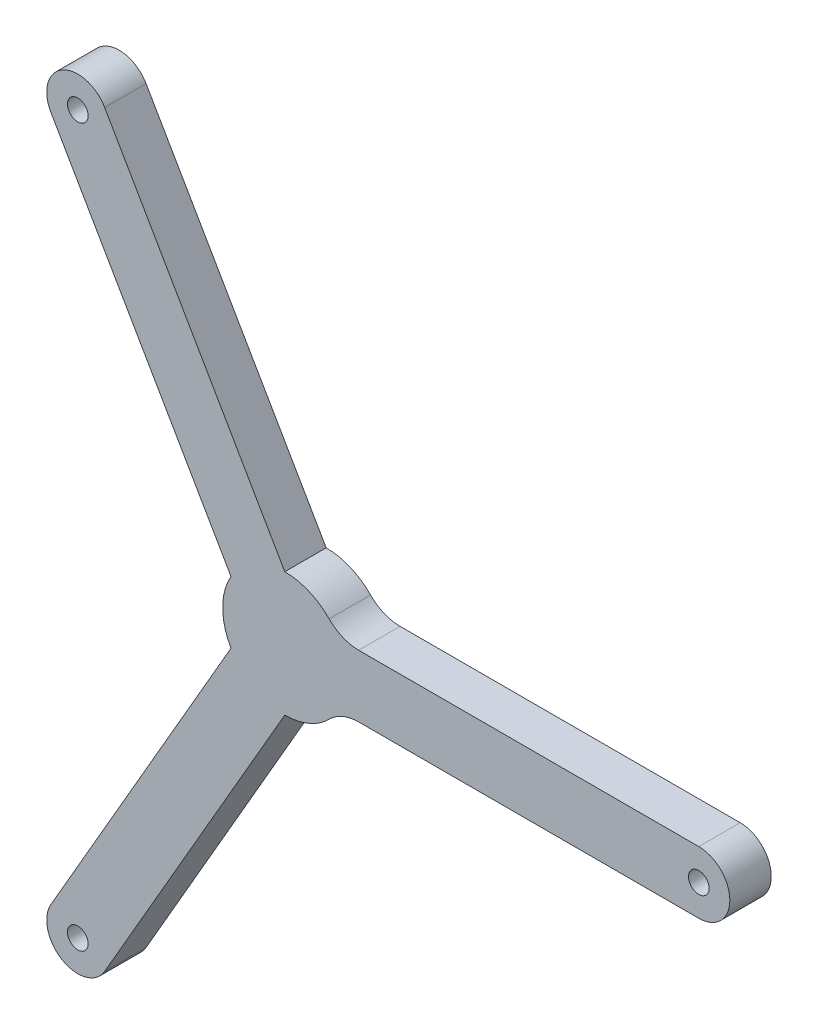
ISO-10303-21;
HEADER;
FILE_DESCRIPTION(('STEP AP214'),'2;1');
FILE_NAME('part.step','',(''),(''),'','','');
FILE_SCHEMA(('AUTOMOTIVE_DESIGN { 1 0 10303 214 1 1 1 1 }'));
ENDSEC;
DATA;
#1=APPLICATION_CONTEXT('core data for automotive mechanical design processes');
#2=APPLICATION_PROTOCOL_DEFINITION('international standard','automotive_design',2000,#1);
#3=PRODUCT_CONTEXT('',#1,'mechanical');
#4=PRODUCT('Part','Part','',(#3));
#5=PRODUCT_RELATED_PRODUCT_CATEGORY('part','',(#4));
#6=PRODUCT_DEFINITION_FORMATION('','',#4);
#7=PRODUCT_DEFINITION_CONTEXT('part definition',#1,'design');
#8=PRODUCT_DEFINITION('design','',#6,#7);
#9=PRODUCT_DEFINITION_SHAPE('','',#8);
#10=(LENGTH_UNIT() NAMED_UNIT(*) SI_UNIT(.MILLI.,.METRE.));
#11=(NAMED_UNIT(*) PLANE_ANGLE_UNIT() SI_UNIT($,.RADIAN.));
#12=(NAMED_UNIT(*) SI_UNIT($,.STERADIAN.) SOLID_ANGLE_UNIT());
#13=UNCERTAINTY_MEASURE_WITH_UNIT(LENGTH_MEASURE(1.E-05),#10,'distance_accuracy_value','');
#14=(GEOMETRIC_REPRESENTATION_CONTEXT(3) GLOBAL_UNCERTAINTY_ASSIGNED_CONTEXT((#13)) GLOBAL_UNIT_ASSIGNED_CONTEXT((#10,
#11,#12)) REPRESENTATION_CONTEXT('',''));
#15=CARTESIAN_POINT('',(0.,0.,0.));
#16=DIRECTION('',(0.,0.,1.));
#17=DIRECTION('',(1.,0.,0.));
#18=AXIS2_PLACEMENT_3D('',#15,#16,#17);
#19=CARTESIAN_POINT('',(0.,0.,10.));
#20=DIRECTION('',(0.,0.,-1.));
#21=DIRECTION('',(-1.,0.,0.));
#22=AXIS2_PLACEMENT_3D('',#19,#20,#21);
#23=CYLINDRICAL_SURFACE('',#22,15.);
#24=CARTESIAN_POINT('',(0.,0.,0.));
#25=DIRECTION('',(0.,0.,1.));
#26=DIRECTION('',(1.,0.,0.));
#27=AXIS2_PLACEMENT_3D('',#24,#25,#26);
#28=CIRCLE('',#27,15.);
#29=CARTESIAN_POINT('',(-12.9903810567665,7.50000000000012,0.));
#30=VERTEX_POINT('',#29);
#31=CARTESIAN_POINT('',(-12.9903810567666,-7.49999999999994,0.));
#32=VERTEX_POINT('',#31);
#33=EDGE_CURVE('E241',#30,#32,#28,.T.);
#34=ORIENTED_EDGE('',*,*,#33,.T.);
#35=DIRECTION('',(0.,0.,-1.));
#36=VECTOR('',#35,1.);
#37=CARTESIAN_POINT('',(-12.9903810567666,-7.49999999999994,10.));
#38=LINE('',#37,#36);
#39=CARTESIAN_POINT('',(-12.9903810567666,-7.49999999999994,10.));
#40=VERTEX_POINT('',#39);
#41=EDGE_CURVE('E59',#40,#32,#38,.T.);
#42=ORIENTED_EDGE('',*,*,#41,.F.);
#43=CARTESIAN_POINT('',(0.,0.,10.));
#44=DIRECTION('',(0.,0.,1.));
#45=DIRECTION('',(1.,0.,0.));
#46=AXIS2_PLACEMENT_3D('',#43,#44,#45);
#47=CIRCLE('',#46,15.);
#48=CARTESIAN_POINT('',(-12.9903810567665,7.50000000000012,10.));
#49=VERTEX_POINT('',#48);
#50=EDGE_CURVE('E226',#49,#40,#47,.T.);
#51=ORIENTED_EDGE('',*,*,#50,.F.);
#52=DIRECTION('',(0.,0.,-1.));
#53=VECTOR('',#52,1.);
#54=CARTESIAN_POINT('',(-12.9903810567665,7.50000000000012,10.));
#55=LINE('',#54,#53);
#56=EDGE_CURVE('E181',#49,#30,#55,.T.);
#57=ORIENTED_EDGE('',*,*,#56,.T.);
#58=EDGE_LOOP('',(#34,#42,#51,#57));
#59=FACE_BOUND('',#58,.T.);
#60=ADVANCED_FACE('F36',(#59),#23,.T.);
#61=CARTESIAN_POINT('',(10.7121426428143,10.5,0.));
#62=VERTEX_POINT('',#61);
#63=CARTESIAN_POINT('',(1.37043154602168E-13,15.,0.));
#64=VERTEX_POINT('',#63);
#65=EDGE_CURVE('E238',#62,#64,#28,.T.);
#66=ORIENTED_EDGE('',*,*,#65,.T.);
#67=DIRECTION('',(0.,0.,-1.));
#68=VECTOR('',#67,1.);
#69=CARTESIAN_POINT('',(1.37043154602168E-13,15.,10.));
#70=LINE('',#69,#68);
#71=CARTESIAN_POINT('',(1.37043154602168E-13,15.,10.));
#72=VERTEX_POINT('',#71);
#73=EDGE_CURVE('E174',#72,#64,#70,.T.);
#74=ORIENTED_EDGE('',*,*,#73,.F.);
#75=CARTESIAN_POINT('',(10.7121426428143,10.5,10.));
#76=VERTEX_POINT('',#75);
#77=EDGE_CURVE('E163',#76,#72,#47,.T.);
#78=ORIENTED_EDGE('',*,*,#77,.F.);
#79=DIRECTION('',(0.,0.,-1.));
#80=VECTOR('',#79,1.);
#81=CARTESIAN_POINT('',(10.7121426428143,10.5,10.));
#82=LINE('',#81,#80);
#83=EDGE_CURVE('E250',#76,#62,#82,.T.);
#84=ORIENTED_EDGE('',*,*,#83,.T.);
#85=EDGE_LOOP('',(#66,#74,#78,#84));
#86=FACE_BOUND('',#85,.T.);
#87=ADVANCED_FACE('F299',(#86),#23,.T.);
#88=CARTESIAN_POINT('',(0.,-7.5,10.));
#89=DIRECTION('',(0.,-1.,0.));
#90=DIRECTION('',(1.,0.,0.));
#91=AXIS2_PLACEMENT_3D('',#88,#89,#90);
#92=PLANE('',#91);
#93=DIRECTION('',(-1.,0.,0.));
#94=VECTOR('',#93,1.);
#95=CARTESIAN_POINT('',(0.,-7.5,10.));
#96=LINE('',#95,#94);
#97=CARTESIAN_POINT('',(100.,-7.5,10.));
#98=VERTEX_POINT('',#97);
#99=CARTESIAN_POINT('',(17.8535710713571,-7.5,10.));
#100=VERTEX_POINT('',#99);
#101=EDGE_CURVE('E215',#98,#100,#96,.T.);
#102=ORIENTED_EDGE('',*,*,#101,.T.);
#103=DIRECTION('',(0.,0.,-1.));
#104=VECTOR('',#103,1.);
#105=CARTESIAN_POINT('',(17.8535710713571,-7.5,10.));
#106=LINE('',#105,#104);
#107=CARTESIAN_POINT('',(17.8535710713571,-7.5,0.));
#108=VERTEX_POINT('',#107);
#109=EDGE_CURVE('E255',#100,#108,#106,.T.);
#110=ORIENTED_EDGE('',*,*,#109,.T.);
#111=DIRECTION('',(-1.,0.,0.));
#112=VECTOR('',#111,1.);
#113=CARTESIAN_POINT('',(0.,-7.5,0.));
#114=LINE('',#113,#112);
#115=CARTESIAN_POINT('',(100.,-7.5,0.));
#116=VERTEX_POINT('',#115);
#117=EDGE_CURVE('E214',#116,#108,#114,.T.);
#118=ORIENTED_EDGE('',*,*,#117,.F.);
#119=DIRECTION('',(0.,0.,-1.));
#120=VECTOR('',#119,1.);
#121=CARTESIAN_POINT('',(100.,-7.5,10.));
#122=LINE('',#121,#120);
#123=EDGE_CURVE('E246',#98,#116,#122,.T.);
#124=ORIENTED_EDGE('',*,*,#123,.F.);
#125=EDGE_LOOP('',(#102,#110,#118,#124));
#126=FACE_BOUND('',#125,.T.);
#127=ADVANCED_FACE('F304',(#126),#92,.T.);
#128=CARTESIAN_POINT('',(100.,0.,10.));
#129=DIRECTION('',(0.,0.,-1.));
#130=DIRECTION('',(-1.,0.,0.));
#131=AXIS2_PLACEMENT_3D('',#128,#129,#130);
#132=CYLINDRICAL_SURFACE('',#131,7.5);
#133=CARTESIAN_POINT('',(100.,0.,0.));
#134=DIRECTION('',(0.,0.,1.));
#135=DIRECTION('',(1.,0.,0.));
#136=AXIS2_PLACEMENT_3D('',#133,#134,#135);
#137=CIRCLE('',#136,7.5);
#138=CARTESIAN_POINT('',(100.,7.5,0.));
#139=VERTEX_POINT('',#138);
#140=EDGE_CURVE('E232',#116,#139,#137,.T.);
#141=ORIENTED_EDGE('',*,*,#140,.T.);
#142=DIRECTION('',(0.,0.,-1.));
#143=VECTOR('',#142,1.);
#144=CARTESIAN_POINT('',(100.,7.5,10.));
#145=LINE('',#144,#143);
#146=CARTESIAN_POINT('',(100.,7.5,10.));
#147=VERTEX_POINT('',#146);
#148=EDGE_CURVE('E229',#147,#139,#145,.T.);
#149=ORIENTED_EDGE('',*,*,#148,.F.);
#150=CARTESIAN_POINT('',(100.,0.,10.));
#151=DIRECTION('',(0.,0.,1.));
#152=DIRECTION('',(1.,0.,0.));
#153=AXIS2_PLACEMENT_3D('',#150,#151,#152);
#154=CIRCLE('',#153,7.5);
#155=EDGE_CURVE('E218',#98,#147,#154,.T.);
#156=ORIENTED_EDGE('',*,*,#155,.F.);
#157=ORIENTED_EDGE('',*,*,#123,.T.);
#158=EDGE_LOOP('',(#141,#149,#156,#157));
#159=FACE_BOUND('',#158,.T.);
#160=ADVANCED_FACE('F316',(#159),#132,.T.);
#161=CARTESIAN_POINT('',(0.,7.5,10.));
#162=DIRECTION('',(0.,1.,0.));
#163=DIRECTION('',(-1.,0.,0.));
#164=AXIS2_PLACEMENT_3D('',#161,#162,#163);
#165=PLANE('',#164);
#166=DIRECTION('',(1.,0.,0.));
#167=VECTOR('',#166,1.);
#168=CARTESIAN_POINT('',(0.,7.5,0.));
#169=LINE('',#168,#167);
#170=CARTESIAN_POINT('',(17.8535710713571,7.5,0.));
#171=VERTEX_POINT('',#170);
#172=EDGE_CURVE('E235',#171,#139,#169,.T.);
#173=ORIENTED_EDGE('',*,*,#172,.F.);
#174=DIRECTION('',(0.,0.,-1.));
#175=VECTOR('',#174,1.);
#176=CARTESIAN_POINT('',(17.8535710713571,7.5,10.));
#177=LINE('',#176,#175);
#178=CARTESIAN_POINT('',(17.8535710713571,7.5,10.));
#179=VERTEX_POINT('',#178);
#180=EDGE_CURVE('E253',#171,#179,#177,.F.);
#181=ORIENTED_EDGE('',*,*,#180,.T.);
#182=DIRECTION('',(1.,0.,0.));
#183=VECTOR('',#182,1.);
#184=CARTESIAN_POINT('',(0.,7.5,10.));
#185=LINE('',#184,#183);
#186=EDGE_CURVE('E222',#179,#147,#185,.T.);
#187=ORIENTED_EDGE('',*,*,#186,.T.);
#188=ORIENTED_EDGE('',*,*,#148,.T.);
#189=EDGE_LOOP('',(#173,#181,#187,#188));
#190=FACE_BOUND('',#189,.T.);
#191=ADVANCED_FACE('F310',(#190),#165,.T.);
#192=CARTESIAN_POINT('',(0.,-15.,10.));
#193=VERTEX_POINT('',#192);
#194=CARTESIAN_POINT('',(10.7121426428143,-10.5,10.));
#195=VERTEX_POINT('',#194);
#196=EDGE_CURVE('E51',#193,#195,#47,.T.);
#197=ORIENTED_EDGE('',*,*,#196,.F.);
#198=DIRECTION('',(0.,0.,-1.));
#199=VECTOR('',#198,1.);
#200=CARTESIAN_POINT('',(0.,-15.,10.));
#201=LINE('',#200,#199);
#202=CARTESIAN_POINT('',(0.,-15.,0.));
#203=VERTEX_POINT('',#202);
#204=EDGE_CURVE('E208',#193,#203,#201,.T.);
#205=ORIENTED_EDGE('',*,*,#204,.T.);
#206=CARTESIAN_POINT('',(10.7121426428143,-10.5,0.));
#207=VERTEX_POINT('',#206);
#208=EDGE_CURVE('E237',#203,#207,#28,.T.);
#209=ORIENTED_EDGE('',*,*,#208,.T.);
#210=DIRECTION('',(0.,0.,-1.));
#211=VECTOR('',#210,1.);
#212=CARTESIAN_POINT('',(10.7121426428143,-10.5,10.));
#213=LINE('',#212,#211);
#214=EDGE_CURVE('E248',#207,#195,#213,.F.);
#215=ORIENTED_EDGE('',*,*,#214,.T.);
#216=EDGE_LOOP('',(#197,#205,#209,#215));
#217=FACE_BOUND('',#216,.T.);
#218=ADVANCED_FACE('F272',(#217),#23,.T.);
#219=CARTESIAN_POINT('',(100.,0.,10.));
#220=DIRECTION('',(0.,0.,-1.));
#221=DIRECTION('',(-1.,0.,0.));
#222=AXIS2_PLACEMENT_3D('',#219,#220,#221);
#223=CYLINDRICAL_SURFACE('',#222,2.5);
#224=CARTESIAN_POINT('',(100.,0.,10.));
#225=DIRECTION('',(0.,0.,1.));
#226=DIRECTION('',(1.,0.,0.));
#227=AXIS2_PLACEMENT_3D('',#224,#225,#226);
#228=CIRCLE('',#227,2.5);
#229=CARTESIAN_POINT('',(102.5,0.,10.));
#230=VERTEX_POINT('',#229);
#231=EDGE_CURVE('E225',#230,#230,#228,.T.);
#232=ORIENTED_EDGE('',*,*,#231,.T.);
#233=EDGE_LOOP('',(#232));
#234=FACE_BOUND('',#233,.T.);
#235=CARTESIAN_POINT('',(100.,0.,0.));
#236=DIRECTION('',(0.,0.,1.));
#237=DIRECTION('',(1.,0.,0.));
#238=AXIS2_PLACEMENT_3D('',#235,#236,#237);
#239=CIRCLE('',#238,2.5);
#240=CARTESIAN_POINT('',(102.5,0.,0.));
#241=VERTEX_POINT('',#240);
#242=EDGE_CURVE('E219',#241,#241,#239,.T.);
#243=ORIENTED_EDGE('',*,*,#242,.F.);
#244=EDGE_LOOP('',(#243));
#245=FACE_BOUND('',#244,.T.);
#246=ADVANCED_FACE('F309',(#234,#245),#223,.F.);
#247=CARTESIAN_POINT('',(0.,0.,10.));
#248=DIRECTION('',(0.,0.,1.));
#249=DIRECTION('',(1.,0.,0.));
#250=AXIS2_PLACEMENT_3D('',#247,#248,#249);
#251=PLANE('',#250);
#252=ORIENTED_EDGE('',*,*,#196,.T.);
#253=CARTESIAN_POINT('',(17.8535710713571,-17.5,10.));
#254=DIRECTION('',(0.,0.,1.));
#255=DIRECTION('',(1.,0.,0.));
#256=AXIS2_PLACEMENT_3D('',#253,#254,#255);
#257=CIRCLE('',#256,10.);
#258=EDGE_CURVE('E11',#195,#100,#257,.F.);
#259=ORIENTED_EDGE('',*,*,#258,.T.);
#260=ORIENTED_EDGE('',*,*,#101,.F.);
#261=ORIENTED_EDGE('',*,*,#155,.T.);
#262=ORIENTED_EDGE('',*,*,#186,.F.);
#263=CARTESIAN_POINT('',(17.8535710713571,17.5,10.));
#264=DIRECTION('',(0.,0.,1.));
#265=DIRECTION('',(1.,0.,0.));
#266=AXIS2_PLACEMENT_3D('',#263,#264,#265);
#267=CIRCLE('',#266,10.);
#268=EDGE_CURVE('E260',#179,#76,#267,.F.);
#269=ORIENTED_EDGE('',*,*,#268,.T.);
#270=ORIENTED_EDGE('',*,*,#77,.T.);
#271=DIRECTION('',(0.499999999999992,-0.866025403784443,0.));
#272=VECTOR('',#271,1.);
#273=CARTESIAN_POINT('',(6.49519052838332,3.74999999999994,10.));
#274=LINE('',#273,#272);
#275=CARTESIAN_POINT('',(-43.5048094716159,90.3525403784443,10.));
#276=VERTEX_POINT('',#275);
#277=EDGE_CURVE('E141',#276,#72,#274,.T.);
#278=ORIENTED_EDGE('',*,*,#277,.F.);
#279=CARTESIAN_POINT('',(-49.9999999999992,86.6025403784443,10.));
#280=DIRECTION('',(0.,0.,1.));
#281=DIRECTION('',(-0.499999999999992,0.866025403784443,0.));
#282=AXIS2_PLACEMENT_3D('',#279,#280,#281);
#283=CIRCLE('',#282,7.5);
#284=CARTESIAN_POINT('',(-56.4951905283825,82.8525403784444,10.));
#285=VERTEX_POINT('',#284);
#286=EDGE_CURVE('E152',#276,#285,#283,.T.);
#287=ORIENTED_EDGE('',*,*,#286,.T.);
#288=DIRECTION('',(-0.499999999999992,0.866025403784443,0.));
#289=VECTOR('',#288,1.);
#290=CARTESIAN_POINT('',(-6.49519052838332,-3.74999999999994,10.));
#291=LINE('',#290,#289);
#292=EDGE_CURVE('E157',#49,#285,#291,.T.);
#293=ORIENTED_EDGE('',*,*,#292,.F.);
#294=ORIENTED_EDGE('',*,*,#50,.T.);
#295=DIRECTION('',(0.500000000000004,0.866025403784436,0.));
#296=VECTOR('',#295,1.);
#297=CARTESIAN_POINT('',(-6.49519052838327,3.75000000000003,10.));
#298=LINE('',#297,#296);
#299=CARTESIAN_POINT('',(-56.4951905283837,-82.8525403784436,10.));
#300=VERTEX_POINT('',#299);
#301=EDGE_CURVE('E185',#300,#40,#298,.T.);
#302=ORIENTED_EDGE('',*,*,#301,.F.);
#303=CARTESIAN_POINT('',(-50.0000000000004,-86.6025403784437,10.));
#304=DIRECTION('',(0.,0.,1.));
#305=DIRECTION('',(-0.500000000000004,-0.866025403784436,0.));
#306=AXIS2_PLACEMENT_3D('',#303,#304,#305);
#307=CIRCLE('',#306,7.5);
#308=CARTESIAN_POINT('',(-43.5048094716171,-90.3525403784437,10.));
#309=VERTEX_POINT('',#308);
#310=EDGE_CURVE('E188',#300,#309,#307,.T.);
#311=ORIENTED_EDGE('',*,*,#310,.T.);
#312=DIRECTION('',(-0.500000000000004,-0.866025403784436,0.));
#313=VECTOR('',#312,1.);
#314=CARTESIAN_POINT('',(6.49519052838327,-3.75000000000003,10.));
#315=LINE('',#314,#313);
#316=EDGE_CURVE('E191',#193,#309,#315,.T.);
#317=ORIENTED_EDGE('',*,*,#316,.F.);
#318=EDGE_LOOP('',(#252,#259,#260,#261,#262,#269,#270,#278,#287,#293,#294,#302,#311,#317));
#319=FACE_BOUND('',#318,.T.);
#320=ORIENTED_EDGE('',*,*,#231,.F.);
#321=EDGE_LOOP('',(#320));
#322=FACE_BOUND('',#321,.T.);
#323=CARTESIAN_POINT('',(-50.0000000000004,-86.6025403784437,10.));
#324=DIRECTION('',(0.,0.,1.));
#325=DIRECTION('',(-0.500000000000004,-0.866025403784436,0.));
#326=AXIS2_PLACEMENT_3D('',#323,#324,#325);
#327=CIRCLE('',#326,2.5);
#328=CARTESIAN_POINT('',(-51.2500000000004,-88.7676038879048,10.));
#329=VERTEX_POINT('',#328);
#330=EDGE_CURVE('E194',#329,#329,#327,.T.);
#331=ORIENTED_EDGE('',*,*,#330,.F.);
#332=EDGE_LOOP('',(#331));
#333=FACE_BOUND('',#332,.T.);
#334=CARTESIAN_POINT('',(-49.9999999999992,86.6025403784443,10.));
#335=DIRECTION('',(0.,0.,1.));
#336=DIRECTION('',(-0.499999999999992,0.866025403784443,0.));
#337=AXIS2_PLACEMENT_3D('',#334,#335,#336);
#338=CIRCLE('',#337,2.5);
#339=CARTESIAN_POINT('',(-51.2499999999992,88.7676038879054,10.));
#340=VERTEX_POINT('',#339);
#341=EDGE_CURVE('E171',#340,#340,#338,.T.);
#342=ORIENTED_EDGE('',*,*,#341,.F.);
#343=EDGE_LOOP('',(#342));
#344=FACE_BOUND('',#343,.T.);
#345=ADVANCED_FACE('F160',(#319,#322,#333,#344),#251,.T.);
#346=CARTESIAN_POINT('',(0.,0.,0.));
#347=DIRECTION('',(0.,0.,1.));
#348=DIRECTION('',(1.,0.,0.));
#349=AXIS2_PLACEMENT_3D('',#346,#347,#348);
#350=PLANE('',#349);
#351=ORIENTED_EDGE('',*,*,#65,.F.);
#352=CARTESIAN_POINT('',(17.8535710713571,17.5,0.));
#353=DIRECTION('',(0.,0.,1.));
#354=DIRECTION('',(1.,0.,0.));
#355=AXIS2_PLACEMENT_3D('',#352,#353,#354);
#356=CIRCLE('',#355,10.);
#357=EDGE_CURVE('E258',#62,#171,#356,.T.);
#358=ORIENTED_EDGE('',*,*,#357,.T.);
#359=ORIENTED_EDGE('',*,*,#172,.T.);
#360=ORIENTED_EDGE('',*,*,#140,.F.);
#361=ORIENTED_EDGE('',*,*,#117,.T.);
#362=CARTESIAN_POINT('',(17.8535710713571,-17.5,0.));
#363=DIRECTION('',(0.,0.,1.));
#364=DIRECTION('',(1.,0.,0.));
#365=AXIS2_PLACEMENT_3D('',#362,#363,#364);
#366=CIRCLE('',#365,10.);
#367=EDGE_CURVE('E44',#108,#207,#366,.T.);
#368=ORIENTED_EDGE('',*,*,#367,.T.);
#369=ORIENTED_EDGE('',*,*,#208,.F.);
#370=DIRECTION('',(-0.500000000000004,-0.866025403784436,0.));
#371=VECTOR('',#370,1.);
#372=CARTESIAN_POINT('',(6.49519052838327,-3.75000000000003,0.));
#373=LINE('',#372,#371);
#374=CARTESIAN_POINT('',(-43.5048094716171,-90.3525403784437,0.));
#375=VERTEX_POINT('',#374);
#376=EDGE_CURVE('E202',#203,#375,#373,.T.);
#377=ORIENTED_EDGE('',*,*,#376,.T.);
#378=CARTESIAN_POINT('',(-50.0000000000004,-86.6025403784437,0.));
#379=DIRECTION('',(0.,0.,1.));
#380=DIRECTION('',(-0.500000000000004,-0.866025403784436,0.));
#381=AXIS2_PLACEMENT_3D('',#378,#379,#380);
#382=CIRCLE('',#381,7.5);
#383=CARTESIAN_POINT('',(-56.4951905283837,-82.8525403784436,0.));
#384=VERTEX_POINT('',#383);
#385=EDGE_CURVE('E199',#384,#375,#382,.T.);
#386=ORIENTED_EDGE('',*,*,#385,.F.);
#387=DIRECTION('',(0.500000000000004,0.866025403784436,0.));
#388=VECTOR('',#387,1.);
#389=CARTESIAN_POINT('',(-6.49519052838327,3.75000000000003,0.));
#390=LINE('',#389,#388);
#391=EDGE_CURVE('E148',#384,#32,#390,.T.);
#392=ORIENTED_EDGE('',*,*,#391,.T.);
#393=ORIENTED_EDGE('',*,*,#33,.F.);
#394=DIRECTION('',(-0.499999999999992,0.866025403784443,0.));
#395=VECTOR('',#394,1.);
#396=CARTESIAN_POINT('',(-6.49519052838332,-3.74999999999994,0.));
#397=LINE('',#396,#395);
#398=CARTESIAN_POINT('',(-56.4951905283825,82.8525403784444,0.));
#399=VERTEX_POINT('',#398);
#400=EDGE_CURVE('E167',#30,#399,#397,.T.);
#401=ORIENTED_EDGE('',*,*,#400,.T.);
#402=CARTESIAN_POINT('',(-49.9999999999992,86.6025403784443,0.));
#403=DIRECTION('',(0.,0.,1.));
#404=DIRECTION('',(-0.499999999999992,0.866025403784443,0.));
#405=AXIS2_PLACEMENT_3D('',#402,#403,#404);
#406=CIRCLE('',#405,7.5);
#407=CARTESIAN_POINT('',(-43.5048094716159,90.3525403784443,0.));
#408=VERTEX_POINT('',#407);
#409=EDGE_CURVE('E176',#408,#399,#406,.T.);
#410=ORIENTED_EDGE('',*,*,#409,.F.);
#411=DIRECTION('',(0.499999999999992,-0.866025403784443,0.));
#412=VECTOR('',#411,1.);
#413=CARTESIAN_POINT('',(6.49519052838332,3.74999999999994,0.));
#414=LINE('',#413,#412);
#415=EDGE_CURVE('E144',#408,#64,#414,.T.);
#416=ORIENTED_EDGE('',*,*,#415,.T.);
#417=EDGE_LOOP('',(#351,#358,#359,#360,#361,#368,#369,#377,#386,#392,#393,#401,#410,#416));
#418=FACE_BOUND('',#417,.T.);
#419=ORIENTED_EDGE('',*,*,#242,.T.);
#420=EDGE_LOOP('',(#419));
#421=FACE_BOUND('',#420,.T.);
#422=CARTESIAN_POINT('',(-50.0000000000004,-86.6025403784437,0.));
#423=DIRECTION('',(0.,0.,1.));
#424=DIRECTION('',(-0.500000000000004,-0.866025403784436,0.));
#425=AXIS2_PLACEMENT_3D('',#422,#423,#424);
#426=CIRCLE('',#425,2.5);
#427=CARTESIAN_POINT('',(-51.2500000000004,-88.7676038879048,0.));
#428=VERTEX_POINT('',#427);
#429=EDGE_CURVE('E189',#428,#428,#426,.T.);
#430=ORIENTED_EDGE('',*,*,#429,.T.);
#431=EDGE_LOOP('',(#430));
#432=FACE_BOUND('',#431,.T.);
#433=CARTESIAN_POINT('',(-49.9999999999992,86.6025403784443,0.));
#434=DIRECTION('',(0.,0.,1.));
#435=DIRECTION('',(-0.499999999999992,0.866025403784443,0.));
#436=AXIS2_PLACEMENT_3D('',#433,#434,#435);
#437=CIRCLE('',#436,2.5);
#438=CARTESIAN_POINT('',(-51.2499999999992,88.7676038879054,0.));
#439=VERTEX_POINT('',#438);
#440=EDGE_CURVE('E164',#439,#439,#437,.T.);
#441=ORIENTED_EDGE('',*,*,#440,.T.);
#442=EDGE_LOOP('',(#441));
#443=FACE_BOUND('',#442,.T.);
#444=ADVANCED_FACE('F265',(#418,#421,#432,#443),#350,.F.);
#445=CARTESIAN_POINT('',(17.8535710713571,17.5,10.));
#446=DIRECTION('',(0.,0.,-1.));
#447=DIRECTION('',(-1.,0.,0.));
#448=AXIS2_PLACEMENT_3D('',#445,#446,#447);
#449=CYLINDRICAL_SURFACE('',#448,10.);
#450=ORIENTED_EDGE('',*,*,#268,.F.);
#451=ORIENTED_EDGE('',*,*,#180,.F.);
#452=ORIENTED_EDGE('',*,*,#357,.F.);
#453=ORIENTED_EDGE('',*,*,#83,.F.);
#454=EDGE_LOOP('',(#450,#451,#452,#453));
#455=FACE_BOUND('',#454,.T.);
#456=ADVANCED_FACE('F327',(#455),#449,.F.);
#457=CARTESIAN_POINT('',(17.8535710713571,-17.5,10.));
#458=DIRECTION('',(0.,0.,-1.));
#459=DIRECTION('',(-1.,0.,0.));
#460=AXIS2_PLACEMENT_3D('',#457,#458,#459);
#461=CYLINDRICAL_SURFACE('',#460,10.);
#462=ORIENTED_EDGE('',*,*,#258,.F.);
#463=ORIENTED_EDGE('',*,*,#214,.F.);
#464=ORIENTED_EDGE('',*,*,#367,.F.);
#465=ORIENTED_EDGE('',*,*,#109,.F.);
#466=EDGE_LOOP('',(#462,#463,#464,#465));
#467=FACE_BOUND('',#466,.T.);
#468=ADVANCED_FACE('F38',(#467),#461,.F.);
#469=CARTESIAN_POINT('',(-49.9999999999992,86.6025403784443,10.));
#470=DIRECTION('',(0.,0.,-1.));
#471=DIRECTION('',(-1.,0.,0.));
#472=AXIS2_PLACEMENT_3D('',#469,#470,#471);
#473=CYLINDRICAL_SURFACE('',#472,2.5);
#474=ORIENTED_EDGE('',*,*,#341,.T.);
#475=EDGE_LOOP('',(#474));
#476=FACE_BOUND('',#475,.T.);
#477=ORIENTED_EDGE('',*,*,#440,.F.);
#478=EDGE_LOOP('',(#477));
#479=FACE_BOUND('',#478,.T.);
#480=ADVANCED_FACE('F334',(#476,#479),#473,.F.);
#481=CARTESIAN_POINT('',(-6.49519052838332,-3.74999999999994,10.));
#482=DIRECTION('',(-0.866025403784443,-0.499999999999992,0.));
#483=DIRECTION('',(0.499999999999992,-0.866025403784443,0.));
#484=AXIS2_PLACEMENT_3D('',#481,#482,#483);
#485=PLANE('',#484);
#486=ORIENTED_EDGE('',*,*,#400,.F.);
#487=ORIENTED_EDGE('',*,*,#56,.F.);
#488=ORIENTED_EDGE('',*,*,#292,.T.);
#489=DIRECTION('',(0.,0.,-1.));
#490=VECTOR('',#489,1.);
#491=CARTESIAN_POINT('',(-56.4951905283825,82.8525403784444,10.));
#492=LINE('',#491,#490);
#493=EDGE_CURVE('E149',#285,#399,#492,.T.);
#494=ORIENTED_EDGE('',*,*,#493,.T.);
#495=EDGE_LOOP('',(#486,#487,#488,#494));
#496=FACE_BOUND('',#495,.T.);
#497=ADVANCED_FACE('F341',(#496),#485,.T.);
#498=CARTESIAN_POINT('',(-49.9999999999992,86.6025403784443,10.));
#499=DIRECTION('',(0.,0.,-1.));
#500=DIRECTION('',(-1.,0.,0.));
#501=AXIS2_PLACEMENT_3D('',#498,#499,#500);
#502=CYLINDRICAL_SURFACE('',#501,7.5);
#503=ORIENTED_EDGE('',*,*,#409,.T.);
#504=ORIENTED_EDGE('',*,*,#493,.F.);
#505=ORIENTED_EDGE('',*,*,#286,.F.);
#506=DIRECTION('',(0.,0.,-1.));
#507=VECTOR('',#506,1.);
#508=CARTESIAN_POINT('',(-43.5048094716159,90.3525403784443,10.));
#509=LINE('',#508,#507);
#510=EDGE_CURVE('E137',#276,#408,#509,.T.);
#511=ORIENTED_EDGE('',*,*,#510,.T.);
#512=EDGE_LOOP('',(#503,#504,#505,#511));
#513=FACE_BOUND('',#512,.T.);
#514=ADVANCED_FACE('F153',(#513),#502,.T.);
#515=CARTESIAN_POINT('',(6.49519052838332,3.74999999999994,10.));
#516=DIRECTION('',(0.866025403784443,0.499999999999992,0.));
#517=DIRECTION('',(-0.499999999999992,0.866025403784443,0.));
#518=AXIS2_PLACEMENT_3D('',#515,#516,#517);
#519=PLANE('',#518);
#520=ORIENTED_EDGE('',*,*,#415,.F.);
#521=ORIENTED_EDGE('',*,*,#510,.F.);
#522=ORIENTED_EDGE('',*,*,#277,.T.);
#523=ORIENTED_EDGE('',*,*,#73,.T.);
#524=EDGE_LOOP('',(#520,#521,#522,#523));
#525=FACE_BOUND('',#524,.T.);
#526=ADVANCED_FACE('F139',(#525),#519,.T.);
#527=CARTESIAN_POINT('',(-6.49519052838327,3.75000000000003,10.));
#528=DIRECTION('',(-0.866025403784436,0.500000000000004,0.));
#529=DIRECTION('',(-0.500000000000004,-0.866025403784436,0.));
#530=AXIS2_PLACEMENT_3D('',#527,#528,#529);
#531=PLANE('',#530);
#532=ORIENTED_EDGE('',*,*,#391,.F.);
#533=DIRECTION('',(0.,0.,-1.));
#534=VECTOR('',#533,1.);
#535=CARTESIAN_POINT('',(-56.4951905283837,-82.8525403784436,10.));
#536=LINE('',#535,#534);
#537=EDGE_CURVE('E212',#300,#384,#536,.T.);
#538=ORIENTED_EDGE('',*,*,#537,.F.);
#539=ORIENTED_EDGE('',*,*,#301,.T.);
#540=ORIENTED_EDGE('',*,*,#41,.T.);
#541=EDGE_LOOP('',(#532,#538,#539,#540));
#542=FACE_BOUND('',#541,.T.);
#543=ADVANCED_FACE('F277',(#542),#531,.T.);
#544=CARTESIAN_POINT('',(-50.0000000000004,-86.6025403784437,10.));
#545=DIRECTION('',(0.,0.,-1.));
#546=DIRECTION('',(-1.,0.,0.));
#547=AXIS2_PLACEMENT_3D('',#544,#545,#546);
#548=CYLINDRICAL_SURFACE('',#547,7.5);
#549=ORIENTED_EDGE('',*,*,#385,.T.);
#550=DIRECTION('',(0.,0.,-1.));
#551=VECTOR('',#550,1.);
#552=CARTESIAN_POINT('',(-43.5048094716171,-90.3525403784437,10.));
#553=LINE('',#552,#551);
#554=EDGE_CURVE('E210',#309,#375,#553,.T.);
#555=ORIENTED_EDGE('',*,*,#554,.F.);
#556=ORIENTED_EDGE('',*,*,#310,.F.);
#557=ORIENTED_EDGE('',*,*,#537,.T.);
#558=EDGE_LOOP('',(#549,#555,#556,#557));
#559=FACE_BOUND('',#558,.T.);
#560=ADVANCED_FACE('F282',(#559),#548,.T.);
#561=CARTESIAN_POINT('',(6.49519052838327,-3.75000000000003,10.));
#562=DIRECTION('',(0.866025403784436,-0.500000000000004,0.));
#563=DIRECTION('',(0.500000000000004,0.866025403784436,0.));
#564=AXIS2_PLACEMENT_3D('',#561,#562,#563);
#565=PLANE('',#564);
#566=ORIENTED_EDGE('',*,*,#376,.F.);
#567=ORIENTED_EDGE('',*,*,#204,.F.);
#568=ORIENTED_EDGE('',*,*,#316,.T.);
#569=ORIENTED_EDGE('',*,*,#554,.T.);
#570=EDGE_LOOP('',(#566,#567,#568,#569));
#571=FACE_BOUND('',#570,.T.);
#572=ADVANCED_FACE('F287',(#571),#565,.T.);
#573=CARTESIAN_POINT('',(-50.0000000000004,-86.6025403784437,10.));
#574=DIRECTION('',(0.,0.,-1.));
#575=DIRECTION('',(-1.,0.,0.));
#576=AXIS2_PLACEMENT_3D('',#573,#574,#575);
#577=CYLINDRICAL_SURFACE('',#576,2.5);
#578=ORIENTED_EDGE('',*,*,#330,.T.);
#579=EDGE_LOOP('',(#578));
#580=FACE_BOUND('',#579,.T.);
#581=ORIENTED_EDGE('',*,*,#429,.F.);
#582=EDGE_LOOP('',(#581));
#583=FACE_BOUND('',#582,.T.);
#584=ADVANCED_FACE('F289',(#580,#583),#577,.F.);
#585=CLOSED_SHELL('',(#60,#87,#127,#160,#191,#218,#246,#345,#444,#456,#468,#480,#497,#514,#526,
#543,#560,#572,#584));
#586=MANIFOLD_SOLID_BREP('B2',#585);
#587=ADVANCED_BREP_SHAPE_REPRESENTATION('',(#18,#586),#14);
#588=SHAPE_DEFINITION_REPRESENTATION(#9,#587);
ENDSEC;
END-ISO-10303-21;
